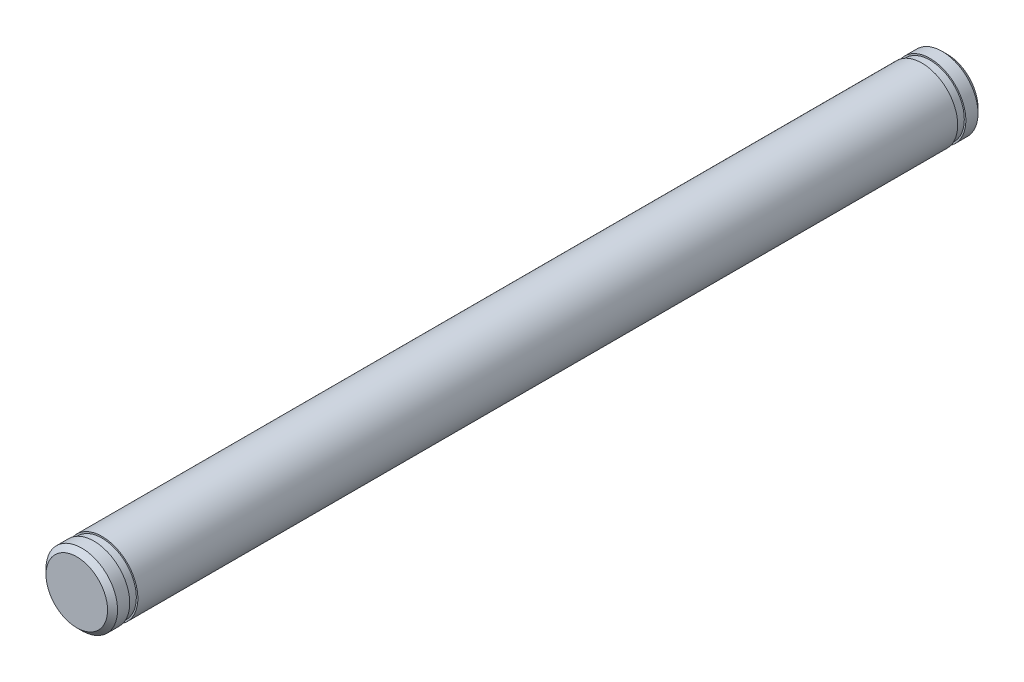
ISO-10303-21;
HEADER;
FILE_DESCRIPTION(('STEP AP214'),'2;1');
FILE_NAME('part.step','',(''),(''),'','','');
FILE_SCHEMA(('AUTOMOTIVE_DESIGN { 1 0 10303 214 1 1 1 1 }'));
ENDSEC;
DATA;
#1=APPLICATION_CONTEXT('core data for automotive mechanical design processes');
#2=APPLICATION_PROTOCOL_DEFINITION('international standard','automotive_design',2000,#1);
#3=PRODUCT_CONTEXT('',#1,'mechanical');
#4=PRODUCT('Part','Part','',(#3));
#5=PRODUCT_RELATED_PRODUCT_CATEGORY('part','',(#4));
#6=PRODUCT_DEFINITION_FORMATION('','',#4);
#7=PRODUCT_DEFINITION_CONTEXT('part definition',#1,'design');
#8=PRODUCT_DEFINITION('design','',#6,#7);
#9=PRODUCT_DEFINITION_SHAPE('','',#8);
#10=(LENGTH_UNIT() NAMED_UNIT(*) SI_UNIT(.MILLI.,.METRE.));
#11=(NAMED_UNIT(*) PLANE_ANGLE_UNIT() SI_UNIT($,.RADIAN.));
#12=(NAMED_UNIT(*) SI_UNIT($,.STERADIAN.) SOLID_ANGLE_UNIT());
#13=UNCERTAINTY_MEASURE_WITH_UNIT(LENGTH_MEASURE(1.E-05),#10,'distance_accuracy_value','');
#14=(GEOMETRIC_REPRESENTATION_CONTEXT(3) GLOBAL_UNCERTAINTY_ASSIGNED_CONTEXT((#13)) GLOBAL_UNIT_ASSIGNED_CONTEXT((#10,
#11,#12)) REPRESENTATION_CONTEXT('',''));
#15=CARTESIAN_POINT('',(0.,0.,0.));
#16=DIRECTION('',(0.,0.,1.));
#17=DIRECTION('',(1.,0.,0.));
#18=AXIS2_PLACEMENT_3D('',#15,#16,#17);
#19=CARTESIAN_POINT('',(0.,0.,48.26));
#20=DIRECTION('',(0.,0.,-1.));
#21=DIRECTION('',(-1.,0.,0.));
#22=AXIS2_PLACEMENT_3D('',#19,#20,#21);
#23=CYLINDRICAL_SURFACE('',#22,3.96875);
#24=CARTESIAN_POINT('',(0.,0.,45.455000022));
#25=DIRECTION('',(0.,0.,1.));
#26=DIRECTION('',(1.,0.,0.));
#27=AXIS2_PLACEMENT_3D('',#24,#25,#26);
#28=CIRCLE('',#27,3.96875);
#29=CARTESIAN_POINT('',(-3.96875,0.,45.455000022));
#30=VERTEX_POINT('',#29);
#31=EDGE_CURVE('E68',#30,#30,#28,.T.);
#32=CARTESIAN_POINT('',(0.,0.,-45.455000022));
#33=DIRECTION('',(0.,0.,-1.));
#34=DIRECTION('',(-1.,0.,0.));
#35=AXIS2_PLACEMENT_3D('',#32,#33,#34);
#36=CIRCLE('',#35,3.96875);
#37=CARTESIAN_POINT('',(-3.96875,0.,-45.455000022));
#38=VERTEX_POINT('',#37);
#39=EDGE_CURVE('E49',#38,#38,#36,.T.);
#40=CARTESIAN_POINT('',(-3.96875,0.,45.455000022));
#41=CARTESIAN_POINT('',(-3.96875,0.,44.508020854875));
#42=CARTESIAN_POINT('',(-3.96875,0.,43.56104168775));
#43=CARTESIAN_POINT('',(-3.96875,0.,41.6670833535));
#44=CARTESIAN_POINT('',(-3.96875,0.,40.720104186375));
#45=CARTESIAN_POINT('',(-3.96875,0.,38.826145852125));
#46=CARTESIAN_POINT('',(-3.96875,0.,37.879166685));
#47=CARTESIAN_POINT('',(-3.96875,0.,35.98520835075));
#48=CARTESIAN_POINT('',(-3.96875,0.,35.038229183625));
#49=CARTESIAN_POINT('',(-3.96875,0.,33.144270849375));
#50=CARTESIAN_POINT('',(-3.96875,0.,32.19729168225));
#51=CARTESIAN_POINT('',(-3.96875,0.,30.303333348));
#52=CARTESIAN_POINT('',(-3.96875,0.,29.356354180875));
#53=CARTESIAN_POINT('',(-3.96875,0.,27.462395846625));
#54=CARTESIAN_POINT('',(-3.96875,0.,26.5154166795));
#55=CARTESIAN_POINT('',(-3.96875,0.,24.62145834525));
#56=CARTESIAN_POINT('',(-3.96875,0.,23.674479178125));
#57=CARTESIAN_POINT('',(-3.96875,0.,21.780520843875));
#58=CARTESIAN_POINT('',(-3.96875,0.,20.83354167675));
#59=CARTESIAN_POINT('',(-3.96875,0.,18.9395833425));
#60=CARTESIAN_POINT('',(-3.96875,0.,17.992604175375));
#61=CARTESIAN_POINT('',(-3.96875,0.,16.098645841125));
#62=CARTESIAN_POINT('',(-3.96875,0.,15.151666674));
#63=CARTESIAN_POINT('',(-3.96875,0.,13.25770833975));
#64=CARTESIAN_POINT('',(-3.96875,0.,12.310729172625));
#65=CARTESIAN_POINT('',(-3.96875,0.,10.416770838375));
#66=CARTESIAN_POINT('',(-3.96875,0.,9.46979167125));
#67=CARTESIAN_POINT('',(-3.96875,0.,7.575833337));
#68=CARTESIAN_POINT('',(-3.96875,0.,6.628854169875));
#69=CARTESIAN_POINT('',(-3.96875,0.,4.73489583562501));
#70=CARTESIAN_POINT('',(-3.96875,0.,3.78791666850001));
#71=CARTESIAN_POINT('',(-3.96875,0.,1.89395833425001));
#72=CARTESIAN_POINT('',(-3.96875,0.,0.946979167125007));
#73=CARTESIAN_POINT('',(-3.96875,0.,-0.946979167124993));
#74=CARTESIAN_POINT('',(-3.96875,0.,-1.89395833424999));
#75=CARTESIAN_POINT('',(-3.96875,0.,-3.78791666849999));
#76=CARTESIAN_POINT('',(-3.96875,0.,-4.73489583562499));
#77=CARTESIAN_POINT('',(-3.96875,0.,-6.628854169875));
#78=CARTESIAN_POINT('',(-3.96875,0.,-7.575833337));
#79=CARTESIAN_POINT('',(-3.96875,0.,-9.46979167125));
#80=CARTESIAN_POINT('',(-3.96875,0.,-10.416770838375));
#81=CARTESIAN_POINT('',(-3.96875,0.,-12.310729172625));
#82=CARTESIAN_POINT('',(-3.96875,0.,-13.25770833975));
#83=CARTESIAN_POINT('',(-3.96875,0.,-15.151666674));
#84=CARTESIAN_POINT('',(-3.96875,0.,-16.098645841125));
#85=CARTESIAN_POINT('',(-3.96875,0.,-17.992604175375));
#86=CARTESIAN_POINT('',(-3.96875,0.,-18.9395833425));
#87=CARTESIAN_POINT('',(-3.96875,0.,-20.83354167675));
#88=CARTESIAN_POINT('',(-3.96875,0.,-21.780520843875));
#89=CARTESIAN_POINT('',(-3.96875,0.,-23.674479178125));
#90=CARTESIAN_POINT('',(-3.96875,0.,-24.62145834525));
#91=CARTESIAN_POINT('',(-3.96875,0.,-26.5154166795));
#92=CARTESIAN_POINT('',(-3.96875,0.,-27.462395846625));
#93=CARTESIAN_POINT('',(-3.96875,0.,-29.356354180875));
#94=CARTESIAN_POINT('',(-3.96875,0.,-30.303333348));
#95=CARTESIAN_POINT('',(-3.96875,0.,-32.19729168225));
#96=CARTESIAN_POINT('',(-3.96875,0.,-33.144270849375));
#97=CARTESIAN_POINT('',(-3.96875,0.,-35.038229183625));
#98=CARTESIAN_POINT('',(-3.96875,0.,-35.98520835075));
#99=CARTESIAN_POINT('',(-3.96875,0.,-37.879166685));
#100=CARTESIAN_POINT('',(-3.96875,0.,-38.826145852125));
#101=CARTESIAN_POINT('',(-3.96875,0.,-40.720104186375));
#102=CARTESIAN_POINT('',(-3.96875,0.,-41.6670833535));
#103=CARTESIAN_POINT('',(-3.96875,0.,-43.56104168775));
#104=CARTESIAN_POINT('',(-3.96875,0.,-44.508020854875));
#105=CARTESIAN_POINT('',(-3.96875,0.,-45.455000022));
#106=B_SPLINE_CURVE_WITH_KNOTS('',3,(#40,#41,#42,#43,#44,#45,#46,#47,#48,#49,#50,#51,#52,#53,
#54,#55,#56,#57,#58,#59,#60,#61,#62,#63,#64,#65,#66,#67,#68,#69,#70,#71,#72,#73,#74,#75,#76,#77,
#78,#79,#80,#81,#82,#83,#84,#85,#86,#87,#88,#89,#90,#91,#92,#93,#94,#95,#96,#97,#98,#99,#100,
#101,#102,#103,#104,#105),.UNSPECIFIED.,.F.,.F.,(4,2,2,2,2,2,2,2,2,2,2,2,2,2,2,2,2,2,2,2,2,2,2,
2,2,2,2,2,2,2,2,2,4),(0.,2.84093750137501,5.68187500275,8.522812504125,11.3637500055,
14.204687506875,17.04562500825,19.886562509625,22.727500011,25.568437512375,28.40937501375,
31.250312515125,34.0912500165,36.932187517875,39.77312501925,42.614062520625,45.455000022,
48.295937523375,51.13687502475,53.977812526125,56.8187500275,59.659687528875,62.50062503025,
65.341562531625,68.182500033,71.023437534375,73.86437503575,76.705312537125,79.5462500385,
82.387187539875,85.22812504125,88.069062542625,90.910000044),.UNSPECIFIED.);
#107=EDGE_CURVE('BSEAM45',#30,#38,#106,.T.);
#108=ORIENTED_EDGE('',*,*,#31,.F.);
#109=ORIENTED_EDGE('',*,*,#39,.F.);
#110=ORIENTED_EDGE('',*,*,#107,.T.);
#111=ORIENTED_EDGE('',*,*,#107,.F.);
#112=EDGE_LOOP('',(#108,#110,#109,#111));
#113=FACE_BOUND('',#112,.T.);
#114=ADVANCED_FACE('F45',(#113),#23,.T.);
#115=CARTESIAN_POINT('',(-3.33066907387547E-13,-3.60822483003176E-13,45.455000022));
#116=DIRECTION('',(0.,0.,1.));
#117=DIRECTION('',(1.,0.,0.));
#118=AXIS2_PLACEMENT_3D('',#115,#116,#117);
#119=PLANE('',#118);
#120=CARTESIAN_POINT('',(-3.33066907387547E-13,-3.60822483003176E-13,45.455000022));
#121=DIRECTION('',(0.,0.,1.));
#122=DIRECTION('',(1.,0.,0.));
#123=AXIS2_PLACEMENT_3D('',#120,#121,#122);
#124=CIRCLE('',#123,3.8);
#125=CARTESIAN_POINT('',(3.79999999999967,-3.60822483003176E-13,45.455000022));
#126=VERTEX_POINT('',#125);
#127=EDGE_CURVE('E69',#126,#126,#124,.T.);
#128=ORIENTED_EDGE('',*,*,#127,.F.);
#129=EDGE_LOOP('',(#128));
#130=FACE_BOUND('',#129,.T.);
#131=ORIENTED_EDGE('',*,*,#31,.T.);
#132=EDGE_LOOP('',(#131));
#133=FACE_BOUND('',#132,.T.);
#134=ADVANCED_FACE('F122',(#130,#133),#119,.T.);
#135=CARTESIAN_POINT('',(-3.33066907387547E-13,-3.60822483003176E-13,46.355));
#136=DIRECTION('',(0.,0.,1.));
#137=DIRECTION('',(1.,0.,0.));
#138=AXIS2_PLACEMENT_3D('',#135,#136,#137);
#139=PLANE('',#138);
#140=CARTESIAN_POINT('',(-3.33066907387547E-13,-3.60822483003176E-13,46.355));
#141=DIRECTION('',(0.,0.,1.));
#142=DIRECTION('',(1.,0.,0.));
#143=AXIS2_PLACEMENT_3D('',#140,#141,#142);
#144=CIRCLE('',#143,3.8);
#145=CARTESIAN_POINT('',(3.79999999999967,-3.60822483003176E-13,46.355));
#146=VERTEX_POINT('',#145);
#147=EDGE_CURVE('E82',#146,#146,#144,.T.);
#148=ORIENTED_EDGE('',*,*,#147,.T.);
#149=EDGE_LOOP('',(#148));
#150=FACE_BOUND('',#149,.T.);
#151=CARTESIAN_POINT('',(0.,0.,46.355));
#152=DIRECTION('',(0.,0.,1.));
#153=DIRECTION('',(1.,0.,0.));
#154=AXIS2_PLACEMENT_3D('',#151,#152,#153);
#155=CIRCLE('',#154,3.96875);
#156=CARTESIAN_POINT('',(-3.96875,0.,46.355));
#157=VERTEX_POINT('',#156);
#158=EDGE_CURVE('E64',#157,#157,#155,.T.);
#159=ORIENTED_EDGE('',*,*,#158,.F.);
#160=EDGE_LOOP('',(#159));
#161=FACE_BOUND('',#160,.T.);
#162=ADVANCED_FACE('F129',(#150,#161),#139,.F.);
#163=CARTESIAN_POINT('',(-3.33066907387547E-13,-3.60822483003176E-13,45.455000022));
#164=DIRECTION('',(0.,0.,1.));
#165=DIRECTION('',(1.,0.,0.));
#166=AXIS2_PLACEMENT_3D('',#163,#164,#165);
#167=CYLINDRICAL_SURFACE('',#166,3.8);
#168=ORIENTED_EDGE('',*,*,#127,.T.);
#169=EDGE_LOOP('',(#168));
#170=FACE_BOUND('',#169,.T.);
#171=ORIENTED_EDGE('',*,*,#147,.F.);
#172=EDGE_LOOP('',(#171));
#173=FACE_BOUND('',#172,.T.);
#174=ADVANCED_FACE('F150',(#170,#173),#167,.T.);
#175=CARTESIAN_POINT('',(0.,0.,48.26));
#176=DIRECTION('',(0.,0.,1.));
#177=DIRECTION('',(1.,0.,0.));
#178=AXIS2_PLACEMENT_3D('',#175,#176,#177);
#179=PLANE('',#178);
#180=CARTESIAN_POINT('',(0.,0.,48.26));
#181=DIRECTION('',(0.,0.,1.));
#182=DIRECTION('',(1.,0.,0.));
#183=AXIS2_PLACEMENT_3D('',#180,#181,#182);
#184=CIRCLE('',#183,3.41312500000006);
#185=CARTESIAN_POINT('',(3.41312500000006,0.,48.26));
#186=VERTEX_POINT('',#185);
#187=EDGE_CURVE('E10',#186,#186,#184,.T.);
#188=ORIENTED_EDGE('',*,*,#187,.T.);
#189=EDGE_LOOP('',(#188));
#190=FACE_BOUND('',#189,.T.);
#191=ADVANCED_FACE('F142',(#190),#179,.T.);
#192=CARTESIAN_POINT('',(0.,0.,48.26));
#193=DIRECTION('',(0.,0.,-1.));
#194=DIRECTION('',(-1.,0.,0.));
#195=AXIS2_PLACEMENT_3D('',#192,#193,#194);
#196=CONICAL_SURFACE('',#195,3.41312500000006,0.785398163397437);
#197=CARTESIAN_POINT('',(0.,0.,47.704375));
#198=DIRECTION('',(0.,0.,1.));
#199=DIRECTION('',(1.,0.,0.));
#200=AXIS2_PLACEMENT_3D('',#197,#198,#199);
#201=CIRCLE('',#200,3.96875);
#202=CARTESIAN_POINT('',(-3.96875,0.,47.704375));
#203=VERTEX_POINT('',#202);
#204=EDGE_CURVE('E72',#203,#203,#201,.F.);
#205=ORIENTED_EDGE('',*,*,#204,.F.);
#206=EDGE_LOOP('',(#205));
#207=FACE_BOUND('',#206,.T.);
#208=ORIENTED_EDGE('',*,*,#187,.F.);
#209=EDGE_LOOP('',(#208));
#210=FACE_BOUND('',#209,.T.);
#211=ADVANCED_FACE('F47',(#207,#210),#196,.T.);
#212=CARTESIAN_POINT('',(-3.96875,0.,46.355));
#213=CARTESIAN_POINT('',(-3.96875,0.,46.3690559895833));
#214=CARTESIAN_POINT('',(-3.96875,0.,46.3831119791667));
#215=CARTESIAN_POINT('',(-3.96875,0.,46.4112239583333));
#216=CARTESIAN_POINT('',(-3.96875,0.,46.4252799479167));
#217=CARTESIAN_POINT('',(-3.96875,0.,46.4533919270833));
#218=CARTESIAN_POINT('',(-3.96875,0.,46.4674479166667));
#219=CARTESIAN_POINT('',(-3.96875,0.,46.4955598958333));
#220=CARTESIAN_POINT('',(-3.96875,0.,46.5096158854167));
#221=CARTESIAN_POINT('',(-3.96875,0.,46.5377278645833));
#222=CARTESIAN_POINT('',(-3.96875,0.,46.5517838541667));
#223=CARTESIAN_POINT('',(-3.96875,0.,46.5798958333333));
#224=CARTESIAN_POINT('',(-3.96875,0.,46.5939518229167));
#225=CARTESIAN_POINT('',(-3.96875,0.,46.6220638020833));
#226=CARTESIAN_POINT('',(-3.96875,0.,46.6361197916667));
#227=CARTESIAN_POINT('',(-3.96875,0.,46.6642317708333));
#228=CARTESIAN_POINT('',(-3.96875,0.,46.6782877604167));
#229=CARTESIAN_POINT('',(-3.96875,0.,46.7063997395833));
#230=CARTESIAN_POINT('',(-3.96875,0.,46.7204557291667));
#231=CARTESIAN_POINT('',(-3.96875,0.,46.7485677083333));
#232=CARTESIAN_POINT('',(-3.96875,0.,46.7626236979167));
#233=CARTESIAN_POINT('',(-3.96875,0.,46.7907356770833));
#234=CARTESIAN_POINT('',(-3.96875,0.,46.8047916666667));
#235=CARTESIAN_POINT('',(-3.96875,0.,46.8329036458333));
#236=CARTESIAN_POINT('',(-3.96875,0.,46.8469596354167));
#237=CARTESIAN_POINT('',(-3.96875,0.,46.8750716145833));
#238=CARTESIAN_POINT('',(-3.96875,0.,46.8891276041667));
#239=CARTESIAN_POINT('',(-3.96875,0.,46.9172395833333));
#240=CARTESIAN_POINT('',(-3.96875,0.,46.9312955729167));
#241=CARTESIAN_POINT('',(-3.96875,0.,46.9594075520833));
#242=CARTESIAN_POINT('',(-3.96875,0.,46.9734635416667));
#243=CARTESIAN_POINT('',(-3.96875,0.,47.0015755208334));
#244=CARTESIAN_POINT('',(-3.96875,0.,47.0156315104167));
#245=CARTESIAN_POINT('',(-3.96875,0.,47.0437434895833));
#246=CARTESIAN_POINT('',(-3.96875,0.,47.0577994791667));
#247=CARTESIAN_POINT('',(-3.96875,0.,47.0859114583333));
#248=CARTESIAN_POINT('',(-3.96875,0.,47.0999674479167));
#249=CARTESIAN_POINT('',(-3.96875,0.,47.1280794270833));
#250=CARTESIAN_POINT('',(-3.96875,0.,47.1421354166667));
#251=CARTESIAN_POINT('',(-3.96875,0.,47.1702473958334));
#252=CARTESIAN_POINT('',(-3.96875,0.,47.1843033854167));
#253=CARTESIAN_POINT('',(-3.96875,0.,47.2124153645834));
#254=CARTESIAN_POINT('',(-3.96875,0.,47.2264713541667));
#255=CARTESIAN_POINT('',(-3.96875,0.,47.2545833333334));
#256=CARTESIAN_POINT('',(-3.96875,0.,47.2686393229167));
#257=CARTESIAN_POINT('',(-3.96875,0.,47.2967513020834));
#258=CARTESIAN_POINT('',(-3.96875,0.,47.3108072916667));
#259=CARTESIAN_POINT('',(-3.96875,0.,47.3389192708334));
#260=CARTESIAN_POINT('',(-3.96875,0.,47.3529752604167));
#261=CARTESIAN_POINT('',(-3.96875,0.,47.3810872395834));
#262=CARTESIAN_POINT('',(-3.96875,0.,47.3951432291667));
#263=CARTESIAN_POINT('',(-3.96875,0.,47.4232552083334));
#264=CARTESIAN_POINT('',(-3.96875,0.,47.4373111979167));
#265=CARTESIAN_POINT('',(-3.96875,0.,47.4654231770834));
#266=CARTESIAN_POINT('',(-3.96875,0.,47.4794791666667));
#267=CARTESIAN_POINT('',(-3.96875,0.,47.5075911458334));
#268=CARTESIAN_POINT('',(-3.96875,0.,47.5216471354167));
#269=CARTESIAN_POINT('',(-3.96875,0.,47.5497591145834));
#270=CARTESIAN_POINT('',(-3.96875,0.,47.5638151041667));
#271=CARTESIAN_POINT('',(-3.96875,0.,47.5919270833334));
#272=CARTESIAN_POINT('',(-3.96875,0.,47.6059830729167));
#273=CARTESIAN_POINT('',(-3.96875,0.,47.6340950520834));
#274=CARTESIAN_POINT('',(-3.96875,0.,47.6481510416667));
#275=CARTESIAN_POINT('',(-3.96875,0.,47.6762630208334));
#276=CARTESIAN_POINT('',(-3.96875,0.,47.6903190104167));
#277=CARTESIAN_POINT('',(-3.96875,0.,47.704375));
#278=B_SPLINE_CURVE_WITH_KNOTS('',3,(#212,#213,#214,#215,#216,#217,#218,#219,#220,#221,#222,
#223,#224,#225,#226,#227,#228,#229,#230,#231,#232,#233,#234,#235,#236,#237,#238,#239,#240,#241,
#242,#243,#244,#245,#246,#247,#248,#249,#250,#251,#252,#253,#254,#255,#256,#257,#258,#259,#260,
#261,#262,#263,#264,#265,#266,#267,#268,#269,#270,#271,#272,#273,#274,#275,#276,#277),
.UNSPECIFIED.,.F.,.F.,(4,2,2,2,2,2,2,2,2,2,2,2,2,2,2,2,2,2,2,2,2,2,2,2,2,2,2,2,2,2,2,2,4),(0.,
0.0421679687499996,0.0843359374999991,0.126503906249999,0.168671875000005,0.210839843750005,
0.253007812500004,0.295175781250004,0.33734375000001,0.37951171875001,0.42167968750001,
0.463847656250009,0.506015625000016,0.548183593750015,0.590351562500015,0.632519531250014,
0.674687500000021,0.71685546875002,0.75902343750002,0.801191406250019,0.843359375000026,
0.885527343750026,0.927695312500025,0.969863281250025,1.01203125000003,1.05419921875003,
1.09636718750003,1.13853515625003,1.18070312500004,1.22287109375004,1.26503906250004,
1.30720703125004,1.34937500000004),.UNSPECIFIED.);
#279=EDGE_CURVE('BSEAM116',#157,#203,#278,.T.);
#280=ORIENTED_EDGE('',*,*,#158,.T.);
#281=ORIENTED_EDGE('',*,*,#204,.T.);
#282=ORIENTED_EDGE('',*,*,#279,.T.);
#283=ORIENTED_EDGE('',*,*,#279,.F.);
#284=EDGE_LOOP('',(#280,#282,#281,#283));
#285=FACE_BOUND('',#284,.T.);
#286=ADVANCED_FACE('F116',(#285),#23,.T.);
#287=CARTESIAN_POINT('',(-3.33066907387547E-13,-3.60822483003176E-13,-45.455000022));
#288=DIRECTION('',(0.,0.,-1.));
#289=DIRECTION('',(1.,0.,0.));
#290=AXIS2_PLACEMENT_3D('',#287,#288,#289);
#291=PLANE('',#290);
#292=CARTESIAN_POINT('',(-3.33066907387547E-13,-3.60822483003176E-13,-45.455000022));
#293=DIRECTION('',(0.,0.,1.));
#294=DIRECTION('',(1.,0.,0.));
#295=AXIS2_PLACEMENT_3D('',#292,#293,#294);
#296=CIRCLE('',#295,3.8);
#297=CARTESIAN_POINT('',(3.79999999999967,-3.60822483003176E-13,-45.455000022));
#298=VERTEX_POINT('',#297);
#299=EDGE_CURVE('E76',#298,#298,#296,.T.);
#300=ORIENTED_EDGE('',*,*,#299,.T.);
#301=EDGE_LOOP('',(#300));
#302=FACE_BOUND('',#301,.T.);
#303=ORIENTED_EDGE('',*,*,#39,.T.);
#304=EDGE_LOOP('',(#303));
#305=FACE_BOUND('',#304,.T.);
#306=ADVANCED_FACE('F135',(#302,#305),#291,.T.);
#307=CARTESIAN_POINT('',(-3.33066907387547E-13,-3.60822483003176E-13,-46.355));
#308=DIRECTION('',(0.,0.,-1.));
#309=DIRECTION('',(1.,0.,0.));
#310=AXIS2_PLACEMENT_3D('',#307,#308,#309);
#311=PLANE('',#310);
#312=CARTESIAN_POINT('',(-3.33066907387547E-13,-3.60822483003176E-13,-46.355));
#313=DIRECTION('',(0.,0.,1.));
#314=DIRECTION('',(1.,0.,0.));
#315=AXIS2_PLACEMENT_3D('',#312,#313,#314);
#316=CIRCLE('',#315,3.8);
#317=CARTESIAN_POINT('',(3.79999999999967,-3.60822483003176E-13,-46.355));
#318=VERTEX_POINT('',#317);
#319=EDGE_CURVE('E84',#318,#318,#316,.T.);
#320=ORIENTED_EDGE('',*,*,#319,.F.);
#321=EDGE_LOOP('',(#320));
#322=FACE_BOUND('',#321,.T.);
#323=CARTESIAN_POINT('',(0.,0.,-46.355));
#324=DIRECTION('',(0.,0.,-1.));
#325=DIRECTION('',(-1.,0.,0.));
#326=AXIS2_PLACEMENT_3D('',#323,#324,#325);
#327=CIRCLE('',#326,3.96875);
#328=CARTESIAN_POINT('',(-3.96875,0.,-46.355));
#329=VERTEX_POINT('',#328);
#330=EDGE_CURVE('E73',#329,#329,#327,.T.);
#331=ORIENTED_EDGE('',*,*,#330,.F.);
#332=EDGE_LOOP('',(#331));
#333=FACE_BOUND('',#332,.T.);
#334=ADVANCED_FACE('F140',(#322,#333),#311,.F.);
#335=CARTESIAN_POINT('',(-3.33066907387547E-13,-3.60822483003176E-13,-45.455000022));
#336=DIRECTION('',(0.,0.,-1.));
#337=DIRECTION('',(-1.,0.,0.));
#338=AXIS2_PLACEMENT_3D('',#335,#336,#337);
#339=CYLINDRICAL_SURFACE('',#338,3.8);
#340=ORIENTED_EDGE('',*,*,#299,.F.);
#341=EDGE_LOOP('',(#340));
#342=FACE_BOUND('',#341,.T.);
#343=ORIENTED_EDGE('',*,*,#319,.T.);
#344=EDGE_LOOP('',(#343));
#345=FACE_BOUND('',#344,.T.);
#346=ADVANCED_FACE('F117',(#342,#345),#339,.T.);
#347=CARTESIAN_POINT('',(0.,0.,-48.26));
#348=DIRECTION('',(0.,0.,1.));
#349=DIRECTION('',(1.,0.,0.));
#350=AXIS2_PLACEMENT_3D('',#347,#348,#349);
#351=PLANE('',#350);
#352=CARTESIAN_POINT('',(0.,0.,-48.26));
#353=DIRECTION('',(0.,0.,1.));
#354=DIRECTION('',(1.,0.,0.));
#355=AXIS2_PLACEMENT_3D('',#352,#353,#354);
#356=CIRCLE('',#355,3.41312499999993);
#357=CARTESIAN_POINT('',(3.41312499999993,0.,-48.26));
#358=VERTEX_POINT('',#357);
#359=EDGE_CURVE('E54',#358,#358,#356,.F.);
#360=ORIENTED_EDGE('',*,*,#359,.T.);
#361=EDGE_LOOP('',(#360));
#362=FACE_BOUND('',#361,.T.);
#363=ADVANCED_FACE('F108',(#362),#351,.F.);
#364=CARTESIAN_POINT('',(0.,0.,-47.7043749999999));
#365=DIRECTION('',(0.,0.,1.));
#366=DIRECTION('',(1.,0.,0.));
#367=AXIS2_PLACEMENT_3D('',#364,#365,#366);
#368=CONICAL_SURFACE('',#367,3.96875,0.785398163397455);
#369=ORIENTED_EDGE('',*,*,#359,.F.);
#370=EDGE_LOOP('',(#369));
#371=FACE_BOUND('',#370,.T.);
#372=CARTESIAN_POINT('',(0.,0.,-47.7043749999999));
#373=DIRECTION('',(0.,0.,1.));
#374=DIRECTION('',(1.,0.,0.));
#375=AXIS2_PLACEMENT_3D('',#372,#373,#374);
#376=CIRCLE('',#375,3.96875);
#377=CARTESIAN_POINT('',(-3.96875,0.,-47.7043749999999));
#378=VERTEX_POINT('',#377);
#379=EDGE_CURVE('E60',#378,#378,#376,.T.);
#380=ORIENTED_EDGE('',*,*,#379,.F.);
#381=EDGE_LOOP('',(#380));
#382=FACE_BOUND('',#381,.T.);
#383=ADVANCED_FACE('F106',(#371,#382),#368,.T.);
#384=CARTESIAN_POINT('',(-3.96875,0.,-46.355));
#385=CARTESIAN_POINT('',(-3.96875,0.,-46.3690559895833));
#386=CARTESIAN_POINT('',(-3.96875,0.,-46.3831119791667));
#387=CARTESIAN_POINT('',(-3.96875,0.,-46.4112239583333));
#388=CARTESIAN_POINT('',(-3.96875,0.,-46.4252799479167));
#389=CARTESIAN_POINT('',(-3.96875,0.,-46.4533919270833));
#390=CARTESIAN_POINT('',(-3.96875,0.,-46.4674479166667));
#391=CARTESIAN_POINT('',(-3.96875,0.,-46.4955598958333));
#392=CARTESIAN_POINT('',(-3.96875,0.,-46.5096158854167));
#393=CARTESIAN_POINT('',(-3.96875,0.,-46.5377278645833));
#394=CARTESIAN_POINT('',(-3.96875,0.,-46.5517838541667));
#395=CARTESIAN_POINT('',(-3.96875,0.,-46.5798958333333));
#396=CARTESIAN_POINT('',(-3.96875,0.,-46.5939518229167));
#397=CARTESIAN_POINT('',(-3.96875,0.,-46.6220638020833));
#398=CARTESIAN_POINT('',(-3.96875,0.,-46.6361197916667));
#399=CARTESIAN_POINT('',(-3.96875,0.,-46.6642317708333));
#400=CARTESIAN_POINT('',(-3.96875,0.,-46.6782877604167));
#401=CARTESIAN_POINT('',(-3.96875,0.,-46.7063997395833));
#402=CARTESIAN_POINT('',(-3.96875,0.,-46.7204557291667));
#403=CARTESIAN_POINT('',(-3.96875,0.,-46.7485677083333));
#404=CARTESIAN_POINT('',(-3.96875,0.,-46.7626236979166));
#405=CARTESIAN_POINT('',(-3.96875,0.,-46.7907356770833));
#406=CARTESIAN_POINT('',(-3.96875,0.,-46.8047916666666));
#407=CARTESIAN_POINT('',(-3.96875,0.,-46.8329036458333));
#408=CARTESIAN_POINT('',(-3.96875,0.,-46.8469596354166));
#409=CARTESIAN_POINT('',(-3.96875,0.,-46.8750716145833));
#410=CARTESIAN_POINT('',(-3.96875,0.,-46.8891276041666));
#411=CARTESIAN_POINT('',(-3.96875,0.,-46.9172395833333));
#412=CARTESIAN_POINT('',(-3.96875,0.,-46.9312955729166));
#413=CARTESIAN_POINT('',(-3.96875,0.,-46.9594075520833));
#414=CARTESIAN_POINT('',(-3.96875,0.,-46.9734635416666));
#415=CARTESIAN_POINT('',(-3.96875,0.,-47.0015755208333));
#416=CARTESIAN_POINT('',(-3.96875,0.,-47.0156315104166));
#417=CARTESIAN_POINT('',(-3.96875,0.,-47.0437434895833));
#418=CARTESIAN_POINT('',(-3.96875,0.,-47.0577994791666));
#419=CARTESIAN_POINT('',(-3.96875,0.,-47.0859114583333));
#420=CARTESIAN_POINT('',(-3.96875,0.,-47.0999674479166));
#421=CARTESIAN_POINT('',(-3.96875,0.,-47.1280794270833));
#422=CARTESIAN_POINT('',(-3.96875,0.,-47.1421354166666));
#423=CARTESIAN_POINT('',(-3.96875,0.,-47.1702473958333));
#424=CARTESIAN_POINT('',(-3.96875,0.,-47.1843033854166));
#425=CARTESIAN_POINT('',(-3.96875,0.,-47.2124153645833));
#426=CARTESIAN_POINT('',(-3.96875,0.,-47.2264713541666));
#427=CARTESIAN_POINT('',(-3.96875,0.,-47.2545833333333));
#428=CARTESIAN_POINT('',(-3.96875,0.,-47.2686393229166));
#429=CARTESIAN_POINT('',(-3.96875,0.,-47.2967513020833));
#430=CARTESIAN_POINT('',(-3.96875,0.,-47.3108072916666));
#431=CARTESIAN_POINT('',(-3.96875,0.,-47.3389192708333));
#432=CARTESIAN_POINT('',(-3.96875,0.,-47.3529752604166));
#433=CARTESIAN_POINT('',(-3.96875,0.,-47.3810872395833));
#434=CARTESIAN_POINT('',(-3.96875,0.,-47.3951432291666));
#435=CARTESIAN_POINT('',(-3.96875,0.,-47.4232552083333));
#436=CARTESIAN_POINT('',(-3.96875,0.,-47.4373111979166));
#437=CARTESIAN_POINT('',(-3.96875,0.,-47.4654231770833));
#438=CARTESIAN_POINT('',(-3.96875,0.,-47.4794791666666));
#439=CARTESIAN_POINT('',(-3.96875,0.,-47.5075911458333));
#440=CARTESIAN_POINT('',(-3.96875,0.,-47.5216471354166));
#441=CARTESIAN_POINT('',(-3.96875,0.,-47.5497591145833));
#442=CARTESIAN_POINT('',(-3.96875,0.,-47.5638151041666));
#443=CARTESIAN_POINT('',(-3.96875,0.,-47.5919270833333));
#444=CARTESIAN_POINT('',(-3.96875,0.,-47.6059830729166));
#445=CARTESIAN_POINT('',(-3.96875,0.,-47.6340950520833));
#446=CARTESIAN_POINT('',(-3.96875,0.,-47.6481510416666));
#447=CARTESIAN_POINT('',(-3.96875,0.,-47.6762630208333));
#448=CARTESIAN_POINT('',(-3.96875,0.,-47.6903190104166));
#449=CARTESIAN_POINT('',(-3.96875,0.,-47.7043749999999));
#450=B_SPLINE_CURVE_WITH_KNOTS('',3,(#384,#385,#386,#387,#388,#389,#390,#391,#392,#393,#394,
#395,#396,#397,#398,#399,#400,#401,#402,#403,#404,#405,#406,#407,#408,#409,#410,#411,#412,#413,
#414,#415,#416,#417,#418,#419,#420,#421,#422,#423,#424,#425,#426,#427,#428,#429,#430,#431,#432,
#433,#434,#435,#436,#437,#438,#439,#440,#441,#442,#443,#444,#445,#446,#447,#448,#449),
.UNSPECIFIED.,.F.,.F.,(4,2,2,2,2,2,2,2,2,2,2,2,2,2,2,2,2,2,2,2,2,2,2,2,2,2,2,2,2,2,2,2,4),(0.,
0.0421679687499926,0.0843359374999991,0.126503906249992,0.168671874999998,0.210839843749991,
0.253007812499997,0.29517578124999,0.337343749999997,0.379511718749989,0.421679687499982,
0.463847656249988,0.506015624999981,0.548183593749987,0.59035156249998,0.632519531249986,
0.674687499999979,0.716855468749972,0.759023437499978,0.801191406249971,0.843359374999977,
0.88552734374997,0.927695312499976,0.969863281249969,1.01203124999996,1.05419921874997,
1.09636718749996,1.13853515624997,1.18070312499996,1.22287109374997,1.26503906249996,
1.30720703124997,1.34937499999996),.UNSPECIFIED.);
#451=EDGE_CURVE('BSEAM104',#329,#378,#450,.T.);
#452=ORIENTED_EDGE('',*,*,#330,.T.);
#453=ORIENTED_EDGE('',*,*,#379,.T.);
#454=ORIENTED_EDGE('',*,*,#451,.T.);
#455=ORIENTED_EDGE('',*,*,#451,.F.);
#456=EDGE_LOOP('',(#452,#454,#453,#455));
#457=FACE_BOUND('',#456,.T.);
#458=ADVANCED_FACE('F104',(#457),#23,.T.);
#459=CLOSED_SHELL('',(#114,#134,#162,#174,#191,#211,#286,#306,#334,#346,#363,#383,#458));
#460=MANIFOLD_SOLID_BREP('B2',#459);
#461=ADVANCED_BREP_SHAPE_REPRESENTATION('',(#18,#460),#14);
#462=SHAPE_DEFINITION_REPRESENTATION(#9,#461);
ENDSEC;
END-ISO-10303-21;
